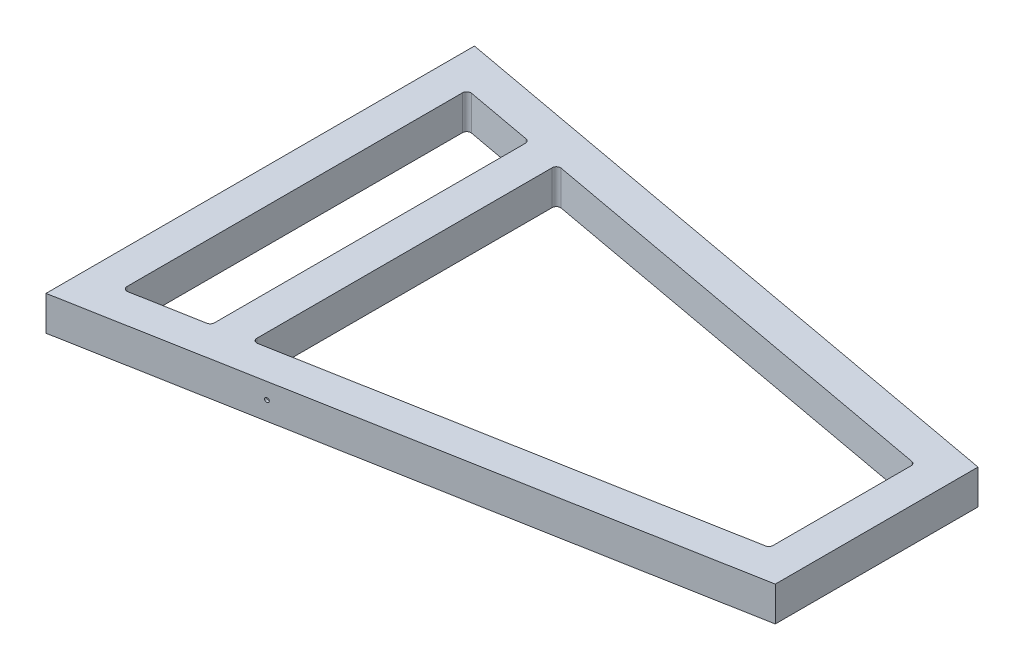
ISO-10303-21;
HEADER;
FILE_DESCRIPTION(('STEP AP214'),'2;1');
FILE_NAME('part.step','',(''),(''),'','','');
FILE_SCHEMA(('AUTOMOTIVE_DESIGN { 1 0 10303 214 1 1 1 1 }'));
ENDSEC;
DATA;
#1=APPLICATION_CONTEXT('core data for automotive mechanical design processes');
#2=APPLICATION_PROTOCOL_DEFINITION('international standard','automotive_design',2000,#1);
#3=PRODUCT_CONTEXT('',#1,'mechanical');
#4=PRODUCT('Part','Part','',(#3));
#5=PRODUCT_RELATED_PRODUCT_CATEGORY('part','',(#4));
#6=PRODUCT_DEFINITION_FORMATION('','',#4);
#7=PRODUCT_DEFINITION_CONTEXT('part definition',#1,'design');
#8=PRODUCT_DEFINITION('design','',#6,#7);
#9=PRODUCT_DEFINITION_SHAPE('','',#8);
#10=(LENGTH_UNIT() NAMED_UNIT(*) SI_UNIT(.MILLI.,.METRE.));
#11=(NAMED_UNIT(*) PLANE_ANGLE_UNIT() SI_UNIT($,.RADIAN.));
#12=(NAMED_UNIT(*) SI_UNIT($,.STERADIAN.) SOLID_ANGLE_UNIT());
#13=UNCERTAINTY_MEASURE_WITH_UNIT(LENGTH_MEASURE(1.E-05),#10,'distance_accuracy_value','');
#14=(GEOMETRIC_REPRESENTATION_CONTEXT(3) GLOBAL_UNCERTAINTY_ASSIGNED_CONTEXT((#13)) GLOBAL_UNIT_ASSIGNED_CONTEXT((#10,
#11,#12)) REPRESENTATION_CONTEXT('',''));
#15=CARTESIAN_POINT('',(0.,0.,0.));
#16=DIRECTION('',(0.,0.,1.));
#17=DIRECTION('',(1.,0.,0.));
#18=AXIS2_PLACEMENT_3D('',#15,#16,#17);
#19=CARTESIAN_POINT('',(117.12676056338,25.,-52.5));
#20=DIRECTION('',(-0.180087544253307,0.,0.9836505865422));
#21=DIRECTION('',(0.9836505865422,0.,0.180087544253307));
#22=AXIS2_PLACEMENT_3D('',#19,#20,#21);
#23=PLANE('',#22);
#24=DIRECTION('',(-0.9836505865422,0.,-0.180087544253307));
#25=VECTOR('',#24,1.);
#26=CARTESIAN_POINT('',(117.12676056338,0.,-52.5));
#27=LINE('',#26,#25);
#28=CARTESIAN_POINT('',(-226.93297680386,0.,-115.490734745265));
#29=VERTEX_POINT('',#28);
#30=CARTESIAN_POINT('',(-275.33297680386,0.,-124.351845856376));
#31=VERTEX_POINT('',#30);
#32=EDGE_CURVE('E370',#29,#31,#27,.T.);
#33=ORIENTED_EDGE('',*,*,#32,.F.);
#34=DIRECTION('',(0.,-1.,0.));
#35=VECTOR('',#34,1.);
#36=CARTESIAN_POINT('',(-226.93297680386,25.,-115.490734745265));
#37=LINE('',#36,#35);
#38=CARTESIAN_POINT('',(-226.93297680386,25.,-115.490734745265));
#39=VERTEX_POINT('',#38);
#40=EDGE_CURVE('E418',#29,#39,#37,.F.);
#41=ORIENTED_EDGE('',*,*,#40,.T.);
#42=DIRECTION('',(-0.9836505865422,0.,-0.180087544253307));
#43=VECTOR('',#42,1.);
#44=CARTESIAN_POINT('',(117.12676056338,25.,-52.5));
#45=LINE('',#44,#43);
#46=CARTESIAN_POINT('',(-275.33297680386,25.,-124.351845856376));
#47=VERTEX_POINT('',#46);
#48=EDGE_CURVE('E356',#39,#47,#45,.T.);
#49=ORIENTED_EDGE('',*,*,#48,.T.);
#50=DIRECTION('',(0.,-1.,0.));
#51=VECTOR('',#50,1.);
#52=CARTESIAN_POINT('',(-275.33297680386,0.,-124.351845856376));
#53=LINE('',#52,#51);
#54=EDGE_CURVE('E415',#47,#31,#53,.T.);
#55=ORIENTED_EDGE('',*,*,#54,.T.);
#56=EDGE_LOOP('',(#33,#41,#49,#55));
#57=FACE_BOUND('',#56,.T.);
#58=ADVANCED_FACE('F61',(#57),#23,.T.);
#59=CARTESIAN_POINT('',(117.12676056338,25.,52.5));
#60=DIRECTION('',(-0.180087544253307,0.,-0.9836505865422));
#61=DIRECTION('',(-0.9836505865422,0.,0.180087544253307));
#62=AXIS2_PLACEMENT_3D('',#59,#60,#61);
#63=PLANE('',#62);
#64=DIRECTION('',(0.9836505865422,0.,-0.180087544253307));
#65=VECTOR('',#64,1.);
#66=CARTESIAN_POINT('',(117.12676056338,0.,52.5));
#67=LINE('',#66,#65);
#68=CARTESIAN_POINT('',(-275.33297680386,0.,124.351845856376));
#69=VERTEX_POINT('',#68);
#70=CARTESIAN_POINT('',(-226.93297680386,0.,115.490734745265));
#71=VERTEX_POINT('',#70);
#72=EDGE_CURVE('E357',#69,#71,#67,.T.);
#73=ORIENTED_EDGE('',*,*,#72,.F.);
#74=DIRECTION('',(0.,-1.,0.));
#75=VECTOR('',#74,1.);
#76=CARTESIAN_POINT('',(-275.33297680386,25.,124.351845856376));
#77=LINE('',#76,#75);
#78=CARTESIAN_POINT('',(-275.33297680386,25.,124.351845856376));
#79=VERTEX_POINT('',#78);
#80=EDGE_CURVE('E437',#69,#79,#77,.F.);
#81=ORIENTED_EDGE('',*,*,#80,.T.);
#82=DIRECTION('',(0.9836505865422,0.,-0.180087544253307));
#83=VECTOR('',#82,1.);
#84=CARTESIAN_POINT('',(117.12676056338,25.,52.5));
#85=LINE('',#84,#83);
#86=CARTESIAN_POINT('',(-226.93297680386,25.,115.490734745265));
#87=VERTEX_POINT('',#86);
#88=EDGE_CURVE('E364',#79,#87,#85,.T.);
#89=ORIENTED_EDGE('',*,*,#88,.T.);
#90=DIRECTION('',(0.,1.,0.));
#91=VECTOR('',#90,1.);
#92=CARTESIAN_POINT('',(-226.93297680386,25.,115.490734745265));
#93=LINE('',#92,#91);
#94=EDGE_CURVE('E435',#87,#71,#93,.F.);
#95=ORIENTED_EDGE('',*,*,#94,.T.);
#96=EDGE_LOOP('',(#73,#81,#89,#95));
#97=FACE_BOUND('',#96,.T.);
#98=ADVANCED_FACE('F511',(#97),#63,.T.);
#99=CARTESIAN_POINT('',(0.,25.,0.));
#100=DIRECTION('',(0.,1.,0.));
#101=DIRECTION('',(0.,0.,1.));
#102=AXIS2_PLACEMENT_3D('',#99,#100,#101);
#103=PLANE('',#102);
#104=ORIENTED_EDGE('',*,*,#48,.F.);
#105=CARTESIAN_POINT('',(-227.47323943662,25.,-112.539782985638));
#106=DIRECTION('',(0.,1.,0.));
#107=DIRECTION('',(0.,0.,1.));
#108=AXIS2_PLACEMENT_3D('',#105,#106,#107);
#109=CIRCLE('',#108,3.);
#110=CARTESIAN_POINT('',(-224.47323943662,25.,-112.539782985638));
#111=VERTEX_POINT('',#110);
#112=EDGE_CURVE('E450',#39,#111,#109,.F.);
#113=ORIENTED_EDGE('',*,*,#112,.T.);
#114=DIRECTION('',(0.,0.,-1.));
#115=VECTOR('',#114,1.);
#116=CARTESIAN_POINT('',(-224.47323943662,25.,-110.463383838384));
#117=LINE('',#116,#115);
#118=CARTESIAN_POINT('',(-224.47323943662,25.,112.539782985638));
#119=VERTEX_POINT('',#118);
#120=EDGE_CURVE('E341',#111,#119,#117,.F.);
#121=ORIENTED_EDGE('',*,*,#120,.T.);
#122=CARTESIAN_POINT('',(-227.47323943662,25.,112.539782985638));
#123=DIRECTION('',(0.,1.,0.));
#124=DIRECTION('',(0.,0.,1.));
#125=AXIS2_PLACEMENT_3D('',#122,#123,#124);
#126=CIRCLE('',#125,3.);
#127=EDGE_CURVE('E460',#119,#87,#126,.F.);
#128=ORIENTED_EDGE('',*,*,#127,.T.);
#129=ORIENTED_EDGE('',*,*,#88,.F.);
#130=CARTESIAN_POINT('',(-275.87323943662,25.,121.400894096749));
#131=DIRECTION('',(0.,1.,0.));
#132=DIRECTION('',(0.,0.,1.));
#133=AXIS2_PLACEMENT_3D('',#130,#131,#132);
#134=CIRCLE('',#133,3.);
#135=CARTESIAN_POINT('',(-278.87323943662,25.,121.400894096749));
#136=VERTEX_POINT('',#135);
#137=EDGE_CURVE('E458',#79,#136,#134,.F.);
#138=ORIENTED_EDGE('',*,*,#137,.T.);
#139=DIRECTION('',(0.,0.,1.));
#140=VECTOR('',#139,1.);
#141=CARTESIAN_POINT('',(-278.87323943662,25.,-125.));
#142=LINE('',#141,#140);
#143=CARTESIAN_POINT('',(-278.87323943662,25.,-121.400894096749));
#144=VERTEX_POINT('',#143);
#145=EDGE_CURVE('E360',#144,#136,#142,.T.);
#146=ORIENTED_EDGE('',*,*,#145,.F.);
#147=CARTESIAN_POINT('',(-275.87323943662,25.,-121.400894096749));
#148=DIRECTION('',(0.,1.,0.));
#149=DIRECTION('',(0.,0.,1.));
#150=AXIS2_PLACEMENT_3D('',#147,#148,#149);
#151=CIRCLE('',#150,3.);
#152=EDGE_CURVE('E12',#144,#47,#151,.F.);
#153=ORIENTED_EDGE('',*,*,#152,.T.);
#154=EDGE_LOOP('',(#104,#113,#121,#128,#129,#138,#146,#153));
#155=FACE_BOUND('',#154,.T.);
#156=DIRECTION('',(0.,0.,-1.));
#157=VECTOR('',#156,1.);
#158=CARTESIAN_POINT('',(142.12676056338,25.,0.));
#159=LINE('',#158,#157);
#160=CARTESIAN_POINT('',(142.12676056338,25.,73.3385087897144));
#161=VERTEX_POINT('',#160);
#162=CARTESIAN_POINT('',(142.12676056338,25.,-73.3385087897144));
#163=VERTEX_POINT('',#162);
#164=EDGE_CURVE('E380',#161,#163,#159,.T.);
#165=ORIENTED_EDGE('',*,*,#164,.T.);
#166=DIRECTION('',(-0.9836505865422,0.,-0.180087544253307));
#167=VECTOR('',#166,1.);
#168=CARTESIAN_POINT('',(17.6008068781914,25.,-96.136821017432));
#169=LINE('',#168,#167);
#170=CARTESIAN_POINT('',(-303.87323943662,25.,-154.992549193755));
#171=VERTEX_POINT('',#170);
#172=EDGE_CURVE('E383',#163,#171,#169,.T.);
#173=ORIENTED_EDGE('',*,*,#172,.T.);
#174=DIRECTION('',(0.,0.,1.));
#175=VECTOR('',#174,1.);
#176=CARTESIAN_POINT('',(-303.87323943662,25.,0.));
#177=LINE('',#176,#175);
#178=CARTESIAN_POINT('',(-303.87323943662,25.,154.992549193755));
#179=VERTEX_POINT('',#178);
#180=EDGE_CURVE('E386',#171,#179,#177,.T.);
#181=ORIENTED_EDGE('',*,*,#180,.T.);
#182=DIRECTION('',(0.9836505865422,0.,-0.180087544253307));
#183=VECTOR('',#182,1.);
#184=CARTESIAN_POINT('',(17.6008068781915,25.,96.136821017432));
#185=LINE('',#184,#183);
#186=EDGE_CURVE('E388',#179,#161,#185,.T.);
#187=ORIENTED_EDGE('',*,*,#186,.T.);
#188=EDGE_LOOP('',(#165,#173,#181,#187));
#189=FACE_BOUND('',#188,.T.);
#190=CARTESIAN_POINT('',(114.66702319614,25.,-52.9503307048609));
#191=VERTEX_POINT('',#190);
#192=CARTESIAN_POINT('',(-195.93297680386,25.,-109.81522969476));
#193=VERTEX_POINT('',#192);
#194=EDGE_CURVE('E358',#191,#193,#45,.T.);
#195=ORIENTED_EDGE('',*,*,#194,.F.);
#196=CARTESIAN_POINT('',(114.12676056338,25.,-49.9993789452343));
#197=DIRECTION('',(0.,1.,0.));
#198=DIRECTION('',(0.,0.,1.));
#199=AXIS2_PLACEMENT_3D('',#196,#197,#198);
#200=CIRCLE('',#199,3.);
#201=CARTESIAN_POINT('',(117.12676056338,25.,-49.9993789452343));
#202=VERTEX_POINT('',#201);
#203=EDGE_CURVE('E470',#191,#202,#200,.F.);
#204=ORIENTED_EDGE('',*,*,#203,.T.);
#205=DIRECTION('',(0.,0.,-1.));
#206=VECTOR('',#205,1.);
#207=CARTESIAN_POINT('',(117.12676056338,25.,-52.5));
#208=LINE('',#207,#206);
#209=CARTESIAN_POINT('',(117.12676056338,25.,49.9993789452342));
#210=VERTEX_POINT('',#209);
#211=EDGE_CURVE('E353',#210,#202,#208,.T.);
#212=ORIENTED_EDGE('',*,*,#211,.F.);
#213=CARTESIAN_POINT('',(114.12676056338,25.,49.9993789452342));
#214=DIRECTION('',(0.,1.,0.));
#215=DIRECTION('',(0.,0.,1.));
#216=AXIS2_PLACEMENT_3D('',#213,#214,#215);
#217=CIRCLE('',#216,3.);
#218=CARTESIAN_POINT('',(114.66702319614,25.,52.9503307048608));
#219=VERTEX_POINT('',#218);
#220=EDGE_CURVE('E466',#210,#219,#217,.F.);
#221=ORIENTED_EDGE('',*,*,#220,.T.);
#222=CARTESIAN_POINT('',(-195.93297680386,25.,109.81522969476));
#223=VERTEX_POINT('',#222);
#224=EDGE_CURVE('E363',#223,#219,#85,.T.);
#225=ORIENTED_EDGE('',*,*,#224,.F.);
#226=CARTESIAN_POINT('',(-196.47323943662,25.,106.864277935133));
#227=DIRECTION('',(0.,1.,0.));
#228=DIRECTION('',(0.,0.,1.));
#229=AXIS2_PLACEMENT_3D('',#226,#227,#228);
#230=CIRCLE('',#229,3.);
#231=CARTESIAN_POINT('',(-199.47323943662,25.,106.864277935133));
#232=VERTEX_POINT('',#231);
#233=EDGE_CURVE('E454',#223,#232,#230,.F.);
#234=ORIENTED_EDGE('',*,*,#233,.T.);
#235=DIRECTION('',(0.,0.,1.));
#236=VECTOR('',#235,1.);
#237=CARTESIAN_POINT('',(-199.47323943662,25.,-110.463383838384));
#238=LINE('',#237,#236);
#239=CARTESIAN_POINT('',(-199.47323943662,25.,-106.864277935133));
#240=VERTEX_POINT('',#239);
#241=EDGE_CURVE('E344',#240,#232,#238,.T.);
#242=ORIENTED_EDGE('',*,*,#241,.F.);
#243=CARTESIAN_POINT('',(-196.47323943662,25.,-106.864277935133));
#244=DIRECTION('',(0.,1.,0.));
#245=DIRECTION('',(0.,0.,1.));
#246=AXIS2_PLACEMENT_3D('',#243,#244,#245);
#247=CIRCLE('',#246,3.);
#248=EDGE_CURVE('E76',#240,#193,#247,.F.);
#249=ORIENTED_EDGE('',*,*,#248,.T.);
#250=EDGE_LOOP('',(#195,#204,#212,#221,#225,#234,#242,#249));
#251=FACE_BOUND('',#250,.T.);
#252=ADVANCED_FACE('F491',(#155,#189,#251),#103,.T.);
#253=CARTESIAN_POINT('',(0.,0.,0.));
#254=DIRECTION('',(0.,1.,0.));
#255=DIRECTION('',(0.,0.,1.));
#256=AXIS2_PLACEMENT_3D('',#253,#254,#255);
#257=PLANE('',#256);
#258=DIRECTION('',(0.,0.,-1.));
#259=VECTOR('',#258,1.);
#260=CARTESIAN_POINT('',(117.12676056338,0.,-52.5));
#261=LINE('',#260,#259);
#262=CARTESIAN_POINT('',(117.12676056338,0.,49.9993789452342));
#263=VERTEX_POINT('',#262);
#264=CARTESIAN_POINT('',(117.12676056338,0.,-49.9993789452343));
#265=VERTEX_POINT('',#264);
#266=EDGE_CURVE('E348',#263,#265,#261,.T.);
#267=ORIENTED_EDGE('',*,*,#266,.T.);
#268=CARTESIAN_POINT('',(114.12676056338,0.,-49.9993789452343));
#269=DIRECTION('',(0.,1.,0.));
#270=DIRECTION('',(0.,0.,1.));
#271=AXIS2_PLACEMENT_3D('',#268,#269,#270);
#272=CIRCLE('',#271,3.);
#273=CARTESIAN_POINT('',(114.66702319614,0.,-52.9503307048609));
#274=VERTEX_POINT('',#273);
#275=EDGE_CURVE('E468',#265,#274,#272,.T.);
#276=ORIENTED_EDGE('',*,*,#275,.T.);
#277=CARTESIAN_POINT('',(-195.93297680386,0.,-109.81522969476));
#278=VERTEX_POINT('',#277);
#279=EDGE_CURVE('E371',#274,#278,#27,.T.);
#280=ORIENTED_EDGE('',*,*,#279,.T.);
#281=CARTESIAN_POINT('',(-196.47323943662,0.,-106.864277935133));
#282=DIRECTION('',(0.,1.,0.));
#283=DIRECTION('',(0.,0.,1.));
#284=AXIS2_PLACEMENT_3D('',#281,#282,#283);
#285=CIRCLE('',#284,3.);
#286=CARTESIAN_POINT('',(-199.47323943662,0.,-106.864277935133));
#287=VERTEX_POINT('',#286);
#288=EDGE_CURVE('E472',#278,#287,#285,.T.);
#289=ORIENTED_EDGE('',*,*,#288,.T.);
#290=DIRECTION('',(0.,0.,1.));
#291=VECTOR('',#290,1.);
#292=CARTESIAN_POINT('',(-199.47323943662,0.,-110.463383838384));
#293=LINE('',#292,#291);
#294=CARTESIAN_POINT('',(-199.47323943662,0.,106.864277935133));
#295=VERTEX_POINT('',#294);
#296=EDGE_CURVE('E345',#287,#295,#293,.T.);
#297=ORIENTED_EDGE('',*,*,#296,.T.);
#298=CARTESIAN_POINT('',(-196.47323943662,0.,106.864277935133));
#299=DIRECTION('',(0.,1.,0.));
#300=DIRECTION('',(0.,0.,1.));
#301=AXIS2_PLACEMENT_3D('',#298,#299,#300);
#302=CIRCLE('',#301,3.);
#303=CARTESIAN_POINT('',(-195.93297680386,0.,109.81522969476));
#304=VERTEX_POINT('',#303);
#305=EDGE_CURVE('E452',#295,#304,#302,.T.);
#306=ORIENTED_EDGE('',*,*,#305,.T.);
#307=CARTESIAN_POINT('',(114.66702319614,0.,52.9503307048608));
#308=VERTEX_POINT('',#307);
#309=EDGE_CURVE('E377',#304,#308,#67,.T.);
#310=ORIENTED_EDGE('',*,*,#309,.T.);
#311=CARTESIAN_POINT('',(114.12676056338,0.,49.9993789452342));
#312=DIRECTION('',(0.,1.,0.));
#313=DIRECTION('',(0.,0.,1.));
#314=AXIS2_PLACEMENT_3D('',#311,#312,#313);
#315=CIRCLE('',#314,3.);
#316=EDGE_CURVE('E464',#308,#263,#315,.T.);
#317=ORIENTED_EDGE('',*,*,#316,.T.);
#318=EDGE_LOOP('',(#267,#276,#280,#289,#297,#306,#310,#317));
#319=FACE_BOUND('',#318,.T.);
#320=DIRECTION('',(0.,0.,-1.));
#321=VECTOR('',#320,1.);
#322=CARTESIAN_POINT('',(142.12676056338,0.,0.));
#323=LINE('',#322,#321);
#324=CARTESIAN_POINT('',(142.12676056338,0.,73.3385087897144));
#325=VERTEX_POINT('',#324);
#326=CARTESIAN_POINT('',(142.12676056338,0.,-73.3385087897144));
#327=VERTEX_POINT('',#326);
#328=EDGE_CURVE('E367',#325,#327,#323,.T.);
#329=ORIENTED_EDGE('',*,*,#328,.F.);
#330=DIRECTION('',(0.9836505865422,0.,-0.180087544253307));
#331=VECTOR('',#330,1.);
#332=CARTESIAN_POINT('',(17.6008068781915,0.,96.136821017432));
#333=LINE('',#332,#331);
#334=CARTESIAN_POINT('',(-303.87323943662,0.,154.992549193755));
#335=VERTEX_POINT('',#334);
#336=EDGE_CURVE('E384',#335,#325,#333,.T.);
#337=ORIENTED_EDGE('',*,*,#336,.F.);
#338=DIRECTION('',(0.,0.,1.));
#339=VECTOR('',#338,1.);
#340=CARTESIAN_POINT('',(-303.87323943662,0.,0.));
#341=LINE('',#340,#339);
#342=CARTESIAN_POINT('',(-303.87323943662,0.,-154.992549193755));
#343=VERTEX_POINT('',#342);
#344=EDGE_CURVE('E395',#343,#335,#341,.T.);
#345=ORIENTED_EDGE('',*,*,#344,.F.);
#346=DIRECTION('',(-0.9836505865422,0.,-0.180087544253307));
#347=VECTOR('',#346,1.);
#348=CARTESIAN_POINT('',(17.6008068781914,0.,-96.136821017432));
#349=LINE('',#348,#347);
#350=EDGE_CURVE('E393',#327,#343,#349,.T.);
#351=ORIENTED_EDGE('',*,*,#350,.F.);
#352=EDGE_LOOP('',(#329,#337,#345,#351));
#353=FACE_BOUND('',#352,.T.);
#354=DIRECTION('',(0.,0.,-1.));
#355=VECTOR('',#354,1.);
#356=CARTESIAN_POINT('',(-224.47323943662,0.,-110.463383838384));
#357=LINE('',#356,#355);
#358=CARTESIAN_POINT('',(-224.47323943662,0.,-112.539782985638));
#359=VERTEX_POINT('',#358);
#360=CARTESIAN_POINT('',(-224.47323943662,0.,112.539782985638));
#361=VERTEX_POINT('',#360);
#362=EDGE_CURVE('E340',#359,#361,#357,.F.);
#363=ORIENTED_EDGE('',*,*,#362,.F.);
#364=CARTESIAN_POINT('',(-227.47323943662,0.,-112.539782985638));
#365=DIRECTION('',(0.,1.,0.));
#366=DIRECTION('',(0.,0.,1.));
#367=AXIS2_PLACEMENT_3D('',#364,#365,#366);
#368=CIRCLE('',#367,3.);
#369=EDGE_CURVE('E448',#359,#29,#368,.T.);
#370=ORIENTED_EDGE('',*,*,#369,.T.);
#371=ORIENTED_EDGE('',*,*,#32,.T.);
#372=CARTESIAN_POINT('',(-275.87323943662,0.,-121.400894096749));
#373=DIRECTION('',(0.,1.,0.));
#374=DIRECTION('',(0.,0.,1.));
#375=AXIS2_PLACEMENT_3D('',#372,#373,#374);
#376=CIRCLE('',#375,3.);
#377=CARTESIAN_POINT('',(-278.87323943662,0.,-121.400894096749));
#378=VERTEX_POINT('',#377);
#379=EDGE_CURVE('E69',#31,#378,#376,.T.);
#380=ORIENTED_EDGE('',*,*,#379,.T.);
#381=DIRECTION('',(0.,0.,1.));
#382=VECTOR('',#381,1.);
#383=CARTESIAN_POINT('',(-278.87323943662,0.,-125.));
#384=LINE('',#383,#382);
#385=CARTESIAN_POINT('',(-278.87323943662,0.,121.400894096749));
#386=VERTEX_POINT('',#385);
#387=EDGE_CURVE('E374',#378,#386,#384,.T.);
#388=ORIENTED_EDGE('',*,*,#387,.T.);
#389=CARTESIAN_POINT('',(-275.87323943662,0.,121.400894096749));
#390=DIRECTION('',(0.,1.,0.));
#391=DIRECTION('',(0.,0.,1.));
#392=AXIS2_PLACEMENT_3D('',#389,#390,#391);
#393=CIRCLE('',#392,3.);
#394=EDGE_CURVE('E456',#386,#69,#393,.T.);
#395=ORIENTED_EDGE('',*,*,#394,.T.);
#396=ORIENTED_EDGE('',*,*,#72,.T.);
#397=CARTESIAN_POINT('',(-227.47323943662,0.,112.539782985638));
#398=DIRECTION('',(0.,1.,0.));
#399=DIRECTION('',(0.,0.,1.));
#400=AXIS2_PLACEMENT_3D('',#397,#398,#399);
#401=CIRCLE('',#400,3.);
#402=EDGE_CURVE('E462',#71,#361,#401,.T.);
#403=ORIENTED_EDGE('',*,*,#402,.T.);
#404=EDGE_LOOP('',(#363,#370,#371,#380,#388,#395,#396,#403));
#405=FACE_BOUND('',#404,.T.);
#406=ADVANCED_FACE('F478',(#319,#353,#405),#257,.F.);
#407=CARTESIAN_POINT('',(142.12676056338,25.,0.));
#408=DIRECTION('',(-1.,0.,0.));
#409=DIRECTION('',(0.,0.,1.));
#410=AXIS2_PLACEMENT_3D('',#407,#408,#409);
#411=PLANE('',#410);
#412=ORIENTED_EDGE('',*,*,#328,.T.);
#413=DIRECTION('',(0.,-1.,0.));
#414=VECTOR('',#413,1.);
#415=CARTESIAN_POINT('',(142.12676056338,25.,-73.3385087897144));
#416=LINE('',#415,#414);
#417=EDGE_CURVE('E406',#163,#327,#416,.T.);
#418=ORIENTED_EDGE('',*,*,#417,.F.);
#419=ORIENTED_EDGE('',*,*,#164,.F.);
#420=DIRECTION('',(0.,-1.,0.));
#421=VECTOR('',#420,1.);
#422=CARTESIAN_POINT('',(142.12676056338,25.,73.3385087897144));
#423=LINE('',#422,#421);
#424=EDGE_CURVE('E390',#161,#325,#423,.T.);
#425=ORIENTED_EDGE('',*,*,#424,.T.);
#426=EDGE_LOOP('',(#412,#418,#419,#425));
#427=FACE_BOUND('',#426,.T.);
#428=ADVANCED_FACE('F572',(#427),#411,.F.);
#429=CARTESIAN_POINT('',(17.6008068781914,25.,-96.136821017432));
#430=DIRECTION('',(-0.180087544253307,0.,0.9836505865422));
#431=DIRECTION('',(0.9836505865422,0.,0.180087544253307));
#432=AXIS2_PLACEMENT_3D('',#429,#430,#431);
#433=PLANE('',#432);
#434=ORIENTED_EDGE('',*,*,#350,.T.);
#435=DIRECTION('',(0.,-1.,0.));
#436=VECTOR('',#435,1.);
#437=CARTESIAN_POINT('',(-303.87323943662,25.,-154.992549193755));
#438=LINE('',#437,#436);
#439=EDGE_CURVE('E403',#171,#343,#438,.T.);
#440=ORIENTED_EDGE('',*,*,#439,.F.);
#441=ORIENTED_EDGE('',*,*,#172,.F.);
#442=ORIENTED_EDGE('',*,*,#417,.T.);
#443=EDGE_LOOP('',(#434,#440,#441,#442));
#444=FACE_BOUND('',#443,.T.);
#445=ADVANCED_FACE('F589',(#444),#433,.F.);
#446=CARTESIAN_POINT('',(-303.87323943662,25.,0.));
#447=DIRECTION('',(1.,0.,0.));
#448=DIRECTION('',(0.,0.,-1.));
#449=AXIS2_PLACEMENT_3D('',#446,#447,#448);
#450=PLANE('',#449);
#451=ORIENTED_EDGE('',*,*,#344,.T.);
#452=DIRECTION('',(0.,-1.,0.));
#453=VECTOR('',#452,1.);
#454=CARTESIAN_POINT('',(-303.87323943662,25.,154.992549193755));
#455=LINE('',#454,#453);
#456=EDGE_CURVE('E400',#179,#335,#455,.T.);
#457=ORIENTED_EDGE('',*,*,#456,.F.);
#458=ORIENTED_EDGE('',*,*,#180,.F.);
#459=ORIENTED_EDGE('',*,*,#439,.T.);
#460=EDGE_LOOP('',(#451,#457,#458,#459));
#461=FACE_BOUND('',#460,.T.);
#462=ADVANCED_FACE('F586',(#461),#450,.F.);
#463=CARTESIAN_POINT('',(17.6008068781915,25.,96.136821017432));
#464=DIRECTION('',(-0.180087544253307,0.,-0.9836505865422));
#465=DIRECTION('',(-0.9836505865422,0.,0.180087544253307));
#466=AXIS2_PLACEMENT_3D('',#463,#464,#465);
#467=PLANE('',#466);
#468=CARTESIAN_POINT('',(-168.76616417077,13.3263532192132,130.257036676649));
#469=DIRECTION('',(0.180087544253307,0.,0.9836505865422));
#470=DIRECTION('',(0.9836505865422,0.,-0.180087544253307));
#471=AXIS2_PLACEMENT_3D('',#468,#469,#470);
#472=CIRCLE('',#471,1.49999999999998);
#473=CARTESIAN_POINT('',(-167.290688290957,13.3263532192132,129.986905360269));
#474=VERTEX_POINT('',#473);
#475=EDGE_CURVE('E337',#474,#474,#472,.T.);
#476=ORIENTED_EDGE('',*,*,#475,.F.);
#477=EDGE_LOOP('',(#476));
#478=FACE_BOUND('',#477,.T.);
#479=ORIENTED_EDGE('',*,*,#336,.T.);
#480=ORIENTED_EDGE('',*,*,#424,.F.);
#481=ORIENTED_EDGE('',*,*,#186,.F.);
#482=ORIENTED_EDGE('',*,*,#456,.T.);
#483=EDGE_LOOP('',(#479,#480,#481,#482));
#484=FACE_BOUND('',#483,.T.);
#485=ADVANCED_FACE('F542',(#478,#484),#467,.F.);
#486=CARTESIAN_POINT('',(117.12676056338,25.,-52.5));
#487=DIRECTION('',(-1.,0.,0.));
#488=DIRECTION('',(0.,0.,1.));
#489=AXIS2_PLACEMENT_3D('',#486,#487,#488);
#490=PLANE('',#489);
#491=ORIENTED_EDGE('',*,*,#266,.F.);
#492=DIRECTION('',(0.,-1.,0.));
#493=VECTOR('',#492,1.);
#494=CARTESIAN_POINT('',(117.12676056338,25.,49.9993789452342));
#495=LINE('',#494,#493);
#496=EDGE_CURVE('E442',#263,#210,#495,.F.);
#497=ORIENTED_EDGE('',*,*,#496,.T.);
#498=ORIENTED_EDGE('',*,*,#211,.T.);
#499=DIRECTION('',(0.,-1.,0.));
#500=VECTOR('',#499,1.);
#501=CARTESIAN_POINT('',(117.12676056338,0.,-49.9993789452343));
#502=LINE('',#501,#500);
#503=EDGE_CURVE('E439',#202,#265,#502,.T.);
#504=ORIENTED_EDGE('',*,*,#503,.T.);
#505=EDGE_LOOP('',(#491,#497,#498,#504));
#506=FACE_BOUND('',#505,.T.);
#507=ADVANCED_FACE('F537',(#506),#490,.T.);
#508=ORIENTED_EDGE('',*,*,#279,.F.);
#509=DIRECTION('',(0.,-1.,0.));
#510=VECTOR('',#509,1.);
#511=CARTESIAN_POINT('',(114.66702319614,25.,-52.9503307048609));
#512=LINE('',#511,#510);
#513=EDGE_CURVE('E83',#274,#191,#512,.F.);
#514=ORIENTED_EDGE('',*,*,#513,.T.);
#515=ORIENTED_EDGE('',*,*,#194,.T.);
#516=DIRECTION('',(0.,-1.,0.));
#517=VECTOR('',#516,1.);
#518=CARTESIAN_POINT('',(-195.93297680386,0.,-109.81522969476));
#519=LINE('',#518,#517);
#520=EDGE_CURVE('E444',#193,#278,#519,.T.);
#521=ORIENTED_EDGE('',*,*,#520,.T.);
#522=EDGE_LOOP('',(#508,#514,#515,#521));
#523=FACE_BOUND('',#522,.T.);
#524=ADVANCED_FACE('F528',(#523),#23,.T.);
#525=CARTESIAN_POINT('',(-278.87323943662,25.,-125.));
#526=DIRECTION('',(1.,0.,0.));
#527=DIRECTION('',(0.,0.,-1.));
#528=AXIS2_PLACEMENT_3D('',#525,#526,#527);
#529=PLANE('',#528);
#530=ORIENTED_EDGE('',*,*,#145,.T.);
#531=DIRECTION('',(0.,-1.,0.));
#532=VECTOR('',#531,1.);
#533=CARTESIAN_POINT('',(-278.87323943662,0.,121.400894096749));
#534=LINE('',#533,#532);
#535=EDGE_CURVE('E432',#136,#386,#534,.T.);
#536=ORIENTED_EDGE('',*,*,#535,.T.);
#537=ORIENTED_EDGE('',*,*,#387,.F.);
#538=DIRECTION('',(0.,-1.,0.));
#539=VECTOR('',#538,1.);
#540=CARTESIAN_POINT('',(-278.87323943662,25.,-121.400894096749));
#541=LINE('',#540,#539);
#542=EDGE_CURVE('E430',#378,#144,#541,.F.);
#543=ORIENTED_EDGE('',*,*,#542,.T.);
#544=EDGE_LOOP('',(#530,#536,#537,#543));
#545=FACE_BOUND('',#544,.T.);
#546=ADVANCED_FACE('F484',(#545),#529,.T.);
#547=ORIENTED_EDGE('',*,*,#309,.F.);
#548=DIRECTION('',(0.,-1.,0.));
#549=VECTOR('',#548,1.);
#550=CARTESIAN_POINT('',(-195.93297680386,25.,109.81522969476));
#551=LINE('',#550,#549);
#552=EDGE_CURVE('E428',#304,#223,#551,.F.);
#553=ORIENTED_EDGE('',*,*,#552,.T.);
#554=ORIENTED_EDGE('',*,*,#224,.T.);
#555=DIRECTION('',(0.,-1.,0.));
#556=VECTOR('',#555,1.);
#557=CARTESIAN_POINT('',(114.66702319614,0.,52.9503307048608));
#558=LINE('',#557,#556);
#559=EDGE_CURVE('E425',#219,#308,#558,.T.);
#560=ORIENTED_EDGE('',*,*,#559,.T.);
#561=EDGE_LOOP('',(#547,#553,#554,#560));
#562=FACE_BOUND('',#561,.T.);
#563=ADVANCED_FACE('F533',(#562),#63,.T.);
#564=CARTESIAN_POINT('',(-224.47323943662,25.,-110.463383838384));
#565=DIRECTION('',(1.,0.,0.));
#566=DIRECTION('',(0.,0.,-1.));
#567=AXIS2_PLACEMENT_3D('',#564,#565,#566);
#568=PLANE('',#567);
#569=ORIENTED_EDGE('',*,*,#120,.F.);
#570=DIRECTION('',(0.,-1.,0.));
#571=VECTOR('',#570,1.);
#572=CARTESIAN_POINT('',(-224.47323943662,25.,-112.539782985638));
#573=LINE('',#572,#571);
#574=EDGE_CURVE('E412',#111,#359,#573,.T.);
#575=ORIENTED_EDGE('',*,*,#574,.T.);
#576=ORIENTED_EDGE('',*,*,#362,.T.);
#577=DIRECTION('',(0.,1.,0.));
#578=VECTOR('',#577,1.);
#579=CARTESIAN_POINT('',(-224.47323943662,25.,112.539782985638));
#580=LINE('',#579,#578);
#581=EDGE_CURVE('E409',#361,#119,#580,.T.);
#582=ORIENTED_EDGE('',*,*,#581,.T.);
#583=EDGE_LOOP('',(#569,#575,#576,#582));
#584=FACE_BOUND('',#583,.T.);
#585=ADVANCED_FACE('F501',(#584),#568,.F.);
#586=CARTESIAN_POINT('',(-199.47323943662,25.,-110.463383838384));
#587=DIRECTION('',(1.,0.,0.));
#588=DIRECTION('',(0.,0.,-1.));
#589=AXIS2_PLACEMENT_3D('',#586,#587,#588);
#590=PLANE('',#589);
#591=ORIENTED_EDGE('',*,*,#241,.T.);
#592=DIRECTION('',(0.,-1.,0.));
#593=VECTOR('',#592,1.);
#594=CARTESIAN_POINT('',(-199.47323943662,0.,106.864277935133));
#595=LINE('',#594,#593);
#596=EDGE_CURVE('E422',#232,#295,#595,.T.);
#597=ORIENTED_EDGE('',*,*,#596,.T.);
#598=ORIENTED_EDGE('',*,*,#296,.F.);
#599=DIRECTION('',(0.,-1.,0.));
#600=VECTOR('',#599,1.);
#601=CARTESIAN_POINT('',(-199.47323943662,25.,-106.864277935133));
#602=LINE('',#601,#600);
#603=EDGE_CURVE('E420',#287,#240,#602,.F.);
#604=ORIENTED_EDGE('',*,*,#603,.T.);
#605=EDGE_LOOP('',(#591,#597,#598,#604));
#606=FACE_BOUND('',#605,.T.);
#607=ADVANCED_FACE('F565',(#606),#590,.T.);
#608=CARTESIAN_POINT('',(-169.126339259277,13.3263532192132,128.289735503564));
#609=DIRECTION('',(0.180087544253307,0.,0.9836505865422));
#610=DIRECTION('',(0.9836505865422,0.,-0.180087544253307));
#611=AXIS2_PLACEMENT_3D('',#608,#609,#610);
#612=CYLINDRICAL_SURFACE('',#611,1.49999999999998);
#613=CARTESIAN_POINT('',(-169.126339259277,13.3263532192132,128.289735503564));
#614=DIRECTION('',(0.180087544253307,0.,0.9836505865422));
#615=DIRECTION('',(0.9836505865422,0.,-0.180087544253307));
#616=AXIS2_PLACEMENT_3D('',#613,#614,#615);
#617=CIRCLE('',#616,1.49999999999998);
#618=CARTESIAN_POINT('',(-167.650863379463,13.3263532192132,128.019604187184));
#619=VERTEX_POINT('',#618);
#620=EDGE_CURVE('E310',#619,#619,#617,.T.);
#621=ORIENTED_EDGE('',*,*,#620,.F.);
#622=EDGE_LOOP('',(#621));
#623=FACE_BOUND('',#622,.T.);
#624=ORIENTED_EDGE('',*,*,#475,.T.);
#625=EDGE_LOOP('',(#624));
#626=FACE_BOUND('',#625,.T.);
#627=ADVANCED_FACE('F620',(#623,#626),#612,.F.);
#628=CARTESIAN_POINT('',(17.2406317896849,25.,94.1695198443476));
#629=DIRECTION('',(-0.180087544253307,0.,-0.9836505865422));
#630=DIRECTION('',(-0.9836505865422,0.,0.180087544253307));
#631=AXIS2_PLACEMENT_3D('',#628,#629,#630);
#632=PLANE('',#631);
#633=DIRECTION('',(0.9836505865422,0.,-0.180087544253307));
#634=VECTOR('',#633,1.);
#635=CARTESIAN_POINT('',(17.2406317896849,2.,94.1695198443476));
#636=LINE('',#635,#634);
#637=CARTESIAN_POINT('',(-301.87323943662,2.,152.593145258254));
#638=VERTEX_POINT('',#637);
#639=CARTESIAN_POINT('',(140.12676056338,2.,71.6714280865372));
#640=VERTEX_POINT('',#639);
#641=EDGE_CURVE('E986',#638,#640,#636,.T.);
#642=ORIENTED_EDGE('',*,*,#641,.F.);
#643=DIRECTION('',(0.,-1.,0.));
#644=VECTOR('',#643,1.);
#645=CARTESIAN_POINT('',(-301.87323943662,25.,152.593145258254));
#646=LINE('',#645,#644);
#647=CARTESIAN_POINT('',(-301.87323943662,23.,152.593145258254));
#648=VERTEX_POINT('',#647);
#649=EDGE_CURVE('E315',#648,#638,#646,.T.);
#650=ORIENTED_EDGE('',*,*,#649,.F.);
#651=DIRECTION('',(0.9836505865422,0.,-0.180087544253307));
#652=VECTOR('',#651,1.);
#653=CARTESIAN_POINT('',(17.2406317896849,23.,94.1695198443476));
#654=LINE('',#653,#652);
#655=CARTESIAN_POINT('',(140.12676056338,23.,71.6714280865372));
#656=VERTEX_POINT('',#655);
#657=EDGE_CURVE('E316',#648,#656,#654,.T.);
#658=ORIENTED_EDGE('',*,*,#657,.T.);
#659=DIRECTION('',(0.,-1.,0.));
#660=VECTOR('',#659,1.);
#661=CARTESIAN_POINT('',(140.12676056338,25.,71.6714280865372));
#662=LINE('',#661,#660);
#663=EDGE_CURVE('E312',#656,#640,#662,.T.);
#664=ORIENTED_EDGE('',*,*,#663,.T.);
#665=EDGE_LOOP('',(#642,#650,#658,#664));
#666=FACE_BOUND('',#665,.T.);
#667=ORIENTED_EDGE('',*,*,#620,.T.);
#668=EDGE_LOOP('',(#667));
#669=FACE_BOUND('',#668,.T.);
#670=ADVANCED_FACE('F623',(#666,#669),#632,.T.);
#671=CARTESIAN_POINT('',(117.486935651887,25.,-54.4673011730844));
#672=DIRECTION('',(-0.180087544253307,0.,0.9836505865422));
#673=DIRECTION('',(0.9836505865422,0.,0.180087544253307));
#674=AXIS2_PLACEMENT_3D('',#671,#672,#673);
#675=PLANE('',#674);
#676=DIRECTION('',(-0.9836505865422,0.,-0.180087544253307));
#677=VECTOR('',#676,1.);
#678=CARTESIAN_POINT('',(117.486935651887,2.,-54.4673011730844));
#679=LINE('',#678,#677);
#680=CARTESIAN_POINT('',(-222.47323943662,2.,-116.707484743581));
#681=VERTEX_POINT('',#680);
#682=CARTESIAN_POINT('',(-280.87323943662,2.,-127.3994039355));
#683=VERTEX_POINT('',#682);
#684=EDGE_CURVE('E271',#681,#683,#679,.T.);
#685=ORIENTED_EDGE('',*,*,#684,.T.);
#686=DIRECTION('',(0.,-1.,0.));
#687=VECTOR('',#686,1.);
#688=CARTESIAN_POINT('',(-280.87323943662,25.,-127.3994039355));
#689=LINE('',#688,#687);
#690=CARTESIAN_POINT('',(-280.87323943662,23.,-127.3994039355));
#691=VERTEX_POINT('',#690);
#692=EDGE_CURVE('E275',#691,#683,#689,.T.);
#693=ORIENTED_EDGE('',*,*,#692,.F.);
#694=DIRECTION('',(-0.9836505865422,0.,-0.180087544253307));
#695=VECTOR('',#694,1.);
#696=CARTESIAN_POINT('',(117.486935651887,23.,-54.4673011730844));
#697=LINE('',#696,#695);
#698=CARTESIAN_POINT('',(-222.47323943662,23.,-116.707484743581));
#699=VERTEX_POINT('',#698);
#700=EDGE_CURVE('E967',#699,#691,#697,.T.);
#701=ORIENTED_EDGE('',*,*,#700,.F.);
#702=DIRECTION('',(0.,-1.,0.));
#703=VECTOR('',#702,1.);
#704=CARTESIAN_POINT('',(-222.47323943662,25.,-116.707484743581));
#705=LINE('',#704,#703);
#706=EDGE_CURVE('E278',#699,#681,#705,.T.);
#707=ORIENTED_EDGE('',*,*,#706,.T.);
#708=EDGE_LOOP('',(#685,#693,#701,#707));
#709=FACE_BOUND('',#708,.T.);
#710=ADVANCED_FACE('F273',(#709),#675,.F.);
#711=CARTESIAN_POINT('',(117.486935651887,25.,54.4673011730844));
#712=DIRECTION('',(-0.180087544253307,0.,-0.9836505865422));
#713=DIRECTION('',(-0.9836505865422,0.,0.180087544253307));
#714=AXIS2_PLACEMENT_3D('',#711,#712,#713);
#715=PLANE('',#714);
#716=DIRECTION('',(0.9836505865422,0.,-0.180087544253307));
#717=VECTOR('',#716,1.);
#718=CARTESIAN_POINT('',(117.486935651887,23.,54.4673011730844));
#719=LINE('',#718,#717);
#720=CARTESIAN_POINT('',(-280.87323943662,23.,127.3994039355));
#721=VERTEX_POINT('',#720);
#722=CARTESIAN_POINT('',(-222.47323943662,23.,116.707484743581));
#723=VERTEX_POINT('',#722);
#724=EDGE_CURVE('E324',#721,#723,#719,.T.);
#725=ORIENTED_EDGE('',*,*,#724,.F.);
#726=DIRECTION('',(0.,-1.,0.));
#727=VECTOR('',#726,1.);
#728=CARTESIAN_POINT('',(-280.87323943662,25.,127.3994039355));
#729=LINE('',#728,#727);
#730=CARTESIAN_POINT('',(-280.87323943662,2.,127.3994039355));
#731=VERTEX_POINT('',#730);
#732=EDGE_CURVE('E292',#721,#731,#729,.T.);
#733=ORIENTED_EDGE('',*,*,#732,.T.);
#734=DIRECTION('',(0.9836505865422,0.,-0.180087544253307));
#735=VECTOR('',#734,1.);
#736=CARTESIAN_POINT('',(117.486935651887,2.,54.4673011730844));
#737=LINE('',#736,#735);
#738=CARTESIAN_POINT('',(-222.47323943662,2.,116.707484743581));
#739=VERTEX_POINT('',#738);
#740=EDGE_CURVE('E297',#731,#739,#737,.T.);
#741=ORIENTED_EDGE('',*,*,#740,.T.);
#742=DIRECTION('',(0.,1.,0.));
#743=VECTOR('',#742,1.);
#744=CARTESIAN_POINT('',(-222.47323943662,25.,116.707484743581));
#745=LINE('',#744,#743);
#746=EDGE_CURVE('E978',#739,#723,#745,.T.);
#747=ORIENTED_EDGE('',*,*,#746,.T.);
#748=EDGE_LOOP('',(#725,#733,#741,#747));
#749=FACE_BOUND('',#748,.T.);
#750=ADVANCED_FACE('F659',(#749),#715,.F.);
#751=CARTESIAN_POINT('',(0.,23.,0.));
#752=DIRECTION('',(0.,1.,0.));
#753=DIRECTION('',(0.,0.,1.));
#754=AXIS2_PLACEMENT_3D('',#751,#752,#753);
#755=PLANE('',#754);
#756=ORIENTED_EDGE('',*,*,#700,.T.);
#757=DIRECTION('',(0.,0.,1.));
#758=VECTOR('',#757,1.);
#759=CARTESIAN_POINT('',(-280.87323943662,23.,-125.));
#760=LINE('',#759,#758);
#761=EDGE_CURVE('E290',#691,#721,#760,.T.);
#762=ORIENTED_EDGE('',*,*,#761,.T.);
#763=ORIENTED_EDGE('',*,*,#724,.T.);
#764=DIRECTION('',(0.,0.,1.));
#765=VECTOR('',#764,1.);
#766=CARTESIAN_POINT('',(-222.47323943662,23.,-110.463383838384));
#767=LINE('',#766,#765);
#768=EDGE_CURVE('E977',#699,#723,#767,.T.);
#769=ORIENTED_EDGE('',*,*,#768,.F.);
#770=EDGE_LOOP('',(#756,#762,#763,#769));
#771=FACE_BOUND('',#770,.T.);
#772=DIRECTION('',(0.,0.,-1.));
#773=VECTOR('',#772,1.);
#774=CARTESIAN_POINT('',(140.12676056338,23.,0.));
#775=LINE('',#774,#773);
#776=CARTESIAN_POINT('',(140.12676056338,23.,-71.6714280865373));
#777=VERTEX_POINT('',#776);
#778=EDGE_CURVE('E988',#656,#777,#775,.T.);
#779=ORIENTED_EDGE('',*,*,#778,.F.);
#780=ORIENTED_EDGE('',*,*,#657,.F.);
#781=DIRECTION('',(0.,0.,1.));
#782=VECTOR('',#781,1.);
#783=CARTESIAN_POINT('',(-301.87323943662,23.,0.));
#784=LINE('',#783,#782);
#785=CARTESIAN_POINT('',(-301.87323943662,23.,-152.593145258254));
#786=VERTEX_POINT('',#785);
#787=EDGE_CURVE('E998',#786,#648,#784,.T.);
#788=ORIENTED_EDGE('',*,*,#787,.F.);
#789=DIRECTION('',(-0.9836505865422,0.,-0.180087544253307));
#790=VECTOR('',#789,1.);
#791=CARTESIAN_POINT('',(17.2406317896848,23.,-94.1695198443476));
#792=LINE('',#791,#790);
#793=EDGE_CURVE('E994',#777,#786,#792,.T.);
#794=ORIENTED_EDGE('',*,*,#793,.F.);
#795=EDGE_LOOP('',(#779,#780,#788,#794));
#796=FACE_BOUND('',#795,.T.);
#797=DIRECTION('',(-0.9836505865422,0.,-0.180087544253307));
#798=VECTOR('',#797,1.);
#799=CARTESIAN_POINT('',(117.486935651887,23.,-54.4673011730844));
#800=LINE('',#799,#798);
#801=CARTESIAN_POINT('',(119.12676056338,23.,-54.1670807031772));
#802=VERTEX_POINT('',#801);
#803=CARTESIAN_POINT('',(-201.47323943662,23.,-112.862787773884));
#804=VERTEX_POINT('',#803);
#805=EDGE_CURVE('E969',#802,#804,#800,.T.);
#806=ORIENTED_EDGE('',*,*,#805,.T.);
#807=DIRECTION('',(0.,0.,1.));
#808=VECTOR('',#807,1.);
#809=CARTESIAN_POINT('',(-201.47323943662,23.,-110.463383838384));
#810=LINE('',#809,#808);
#811=CARTESIAN_POINT('',(-201.47323943662,23.,112.862787773884));
#812=VERTEX_POINT('',#811);
#813=EDGE_CURVE('E332',#804,#812,#810,.T.);
#814=ORIENTED_EDGE('',*,*,#813,.T.);
#815=DIRECTION('',(0.9836505865422,0.,-0.180087544253307));
#816=VECTOR('',#815,1.);
#817=CARTESIAN_POINT('',(117.486935651887,23.,54.4673011730844));
#818=LINE('',#817,#816);
#819=CARTESIAN_POINT('',(119.12676056338,23.,54.1670807031771));
#820=VERTEX_POINT('',#819);
#821=EDGE_CURVE('E955',#812,#820,#818,.T.);
#822=ORIENTED_EDGE('',*,*,#821,.T.);
#823=DIRECTION('',(0.,0.,-1.));
#824=VECTOR('',#823,1.);
#825=CARTESIAN_POINT('',(119.12676056338,23.,-52.5));
#826=LINE('',#825,#824);
#827=EDGE_CURVE('E963',#820,#802,#826,.T.);
#828=ORIENTED_EDGE('',*,*,#827,.T.);
#829=EDGE_LOOP('',(#806,#814,#822,#828));
#830=FACE_BOUND('',#829,.T.);
#831=ADVANCED_FACE('F667',(#771,#796,#830),#755,.F.);
#832=CARTESIAN_POINT('',(0.,2.,0.));
#833=DIRECTION('',(0.,1.,0.));
#834=DIRECTION('',(0.,0.,1.));
#835=AXIS2_PLACEMENT_3D('',#832,#833,#834);
#836=PLANE('',#835);
#837=DIRECTION('',(-0.9836505865422,0.,-0.180087544253307));
#838=VECTOR('',#837,1.);
#839=CARTESIAN_POINT('',(117.486935651887,2.,-54.4673011730844));
#840=LINE('',#839,#838);
#841=CARTESIAN_POINT('',(119.12676056338,2.,-54.1670807031772));
#842=VERTEX_POINT('',#841);
#843=CARTESIAN_POINT('',(-201.47323943662,2.,-112.862787773884));
#844=VERTEX_POINT('',#843);
#845=EDGE_CURVE('E282',#842,#844,#840,.T.);
#846=ORIENTED_EDGE('',*,*,#845,.F.);
#847=DIRECTION('',(0.,0.,-1.));
#848=VECTOR('',#847,1.);
#849=CARTESIAN_POINT('',(119.12676056338,2.,-52.5));
#850=LINE('',#849,#848);
#851=CARTESIAN_POINT('',(119.12676056338,2.,54.1670807031771));
#852=VERTEX_POINT('',#851);
#853=EDGE_CURVE('E283',#852,#842,#850,.T.);
#854=ORIENTED_EDGE('',*,*,#853,.F.);
#855=DIRECTION('',(0.9836505865422,0.,-0.180087544253307));
#856=VECTOR('',#855,1.);
#857=CARTESIAN_POINT('',(117.486935651887,2.,54.4673011730844));
#858=LINE('',#857,#856);
#859=CARTESIAN_POINT('',(-201.47323943662,2.,112.862787773884));
#860=VERTEX_POINT('',#859);
#861=EDGE_CURVE('E298',#860,#852,#858,.T.);
#862=ORIENTED_EDGE('',*,*,#861,.F.);
#863=DIRECTION('',(0.,0.,1.));
#864=VECTOR('',#863,1.);
#865=CARTESIAN_POINT('',(-201.47323943662,2.,-110.463383838384));
#866=LINE('',#865,#864);
#867=EDGE_CURVE('E958',#844,#860,#866,.T.);
#868=ORIENTED_EDGE('',*,*,#867,.F.);
#869=EDGE_LOOP('',(#846,#854,#862,#868));
#870=FACE_BOUND('',#869,.T.);
#871=DIRECTION('',(0.,0.,-1.));
#872=VECTOR('',#871,1.);
#873=CARTESIAN_POINT('',(140.12676056338,2.,0.));
#874=LINE('',#873,#872);
#875=CARTESIAN_POINT('',(140.12676056338,2.,-71.6714280865373));
#876=VERTEX_POINT('',#875);
#877=EDGE_CURVE('E327',#640,#876,#874,.T.);
#878=ORIENTED_EDGE('',*,*,#877,.T.);
#879=DIRECTION('',(-0.9836505865422,0.,-0.180087544253307));
#880=VECTOR('',#879,1.);
#881=CARTESIAN_POINT('',(17.2406317896848,2.,-94.1695198443476));
#882=LINE('',#881,#880);
#883=CARTESIAN_POINT('',(-301.87323943662,2.,-152.593145258254));
#884=VERTEX_POINT('',#883);
#885=EDGE_CURVE('E985',#876,#884,#882,.T.);
#886=ORIENTED_EDGE('',*,*,#885,.T.);
#887=DIRECTION('',(0.,0.,1.));
#888=VECTOR('',#887,1.);
#889=CARTESIAN_POINT('',(-301.87323943662,2.,0.));
#890=LINE('',#889,#888);
#891=EDGE_CURVE('E989',#884,#638,#890,.T.);
#892=ORIENTED_EDGE('',*,*,#891,.T.);
#893=ORIENTED_EDGE('',*,*,#641,.T.);
#894=EDGE_LOOP('',(#878,#886,#892,#893));
#895=FACE_BOUND('',#894,.T.);
#896=DIRECTION('',(0.,0.,1.));
#897=VECTOR('',#896,1.);
#898=CARTESIAN_POINT('',(-222.47323943662,2.,-110.463383838384));
#899=LINE('',#898,#897);
#900=EDGE_CURVE('E305',#681,#739,#899,.T.);
#901=ORIENTED_EDGE('',*,*,#900,.T.);
#902=ORIENTED_EDGE('',*,*,#740,.F.);
#903=DIRECTION('',(0.,0.,1.));
#904=VECTOR('',#903,1.);
#905=CARTESIAN_POINT('',(-280.87323943662,2.,-125.));
#906=LINE('',#905,#904);
#907=EDGE_CURVE('E288',#683,#731,#906,.T.);
#908=ORIENTED_EDGE('',*,*,#907,.F.);
#909=ORIENTED_EDGE('',*,*,#684,.F.);
#910=EDGE_LOOP('',(#901,#902,#908,#909));
#911=FACE_BOUND('',#910,.T.);
#912=ADVANCED_FACE('F295',(#870,#895,#911),#836,.T.);
#913=CARTESIAN_POINT('',(140.12676056338,25.,0.));
#914=DIRECTION('',(-1.,0.,0.));
#915=DIRECTION('',(0.,0.,1.));
#916=AXIS2_PLACEMENT_3D('',#913,#914,#915);
#917=PLANE('',#916);
#918=ORIENTED_EDGE('',*,*,#877,.F.);
#919=ORIENTED_EDGE('',*,*,#663,.F.);
#920=ORIENTED_EDGE('',*,*,#778,.T.);
#921=DIRECTION('',(0.,-1.,0.));
#922=VECTOR('',#921,1.);
#923=CARTESIAN_POINT('',(140.12676056338,25.,-71.6714280865373));
#924=LINE('',#923,#922);
#925=EDGE_CURVE('E307',#777,#876,#924,.T.);
#926=ORIENTED_EDGE('',*,*,#925,.T.);
#927=EDGE_LOOP('',(#918,#919,#920,#926));
#928=FACE_BOUND('',#927,.T.);
#929=ADVANCED_FACE('F682',(#928),#917,.T.);
#930=CARTESIAN_POINT('',(17.2406317896848,25.,-94.1695198443476));
#931=DIRECTION('',(-0.180087544253307,0.,0.9836505865422));
#932=DIRECTION('',(0.9836505865422,0.,0.180087544253307));
#933=AXIS2_PLACEMENT_3D('',#930,#931,#932);
#934=PLANE('',#933);
#935=ORIENTED_EDGE('',*,*,#885,.F.);
#936=ORIENTED_EDGE('',*,*,#925,.F.);
#937=ORIENTED_EDGE('',*,*,#793,.T.);
#938=DIRECTION('',(0.,-1.,0.));
#939=VECTOR('',#938,1.);
#940=CARTESIAN_POINT('',(-301.87323943662,25.,-152.593145258254));
#941=LINE('',#940,#939);
#942=EDGE_CURVE('E311',#786,#884,#941,.T.);
#943=ORIENTED_EDGE('',*,*,#942,.T.);
#944=EDGE_LOOP('',(#935,#936,#937,#943));
#945=FACE_BOUND('',#944,.T.);
#946=ADVANCED_FACE('F690',(#945),#934,.T.);
#947=CARTESIAN_POINT('',(-301.87323943662,25.,0.));
#948=DIRECTION('',(1.,0.,0.));
#949=DIRECTION('',(0.,0.,-1.));
#950=AXIS2_PLACEMENT_3D('',#947,#948,#949);
#951=PLANE('',#950);
#952=ORIENTED_EDGE('',*,*,#891,.F.);
#953=ORIENTED_EDGE('',*,*,#942,.F.);
#954=ORIENTED_EDGE('',*,*,#787,.T.);
#955=ORIENTED_EDGE('',*,*,#649,.T.);
#956=EDGE_LOOP('',(#952,#953,#954,#955));
#957=FACE_BOUND('',#956,.T.);
#958=ADVANCED_FACE('F698',(#957),#951,.T.);
#959=CARTESIAN_POINT('',(119.12676056338,25.,-52.5));
#960=DIRECTION('',(-1.,0.,0.));
#961=DIRECTION('',(0.,0.,1.));
#962=AXIS2_PLACEMENT_3D('',#959,#960,#961);
#963=PLANE('',#962);
#964=ORIENTED_EDGE('',*,*,#853,.T.);
#965=DIRECTION('',(0.,-1.,0.));
#966=VECTOR('',#965,1.);
#967=CARTESIAN_POINT('',(119.12676056338,25.,-54.1670807031772));
#968=LINE('',#967,#966);
#969=EDGE_CURVE('E291',#802,#842,#968,.T.);
#970=ORIENTED_EDGE('',*,*,#969,.F.);
#971=ORIENTED_EDGE('',*,*,#827,.F.);
#972=DIRECTION('',(0.,-1.,0.));
#973=VECTOR('',#972,1.);
#974=CARTESIAN_POINT('',(119.12676056338,25.,54.1670807031771));
#975=LINE('',#974,#973);
#976=EDGE_CURVE('E321',#820,#852,#975,.T.);
#977=ORIENTED_EDGE('',*,*,#976,.T.);
#978=EDGE_LOOP('',(#964,#970,#971,#977));
#979=FACE_BOUND('',#978,.T.);
#980=ADVANCED_FACE('F706',(#979),#963,.F.);
#981=DIRECTION('',(0.,-1.,0.));
#982=VECTOR('',#981,1.);
#983=CARTESIAN_POINT('',(-201.47323943662,25.,-112.862787773884));
#984=LINE('',#983,#982);
#985=EDGE_CURVE('E328',#804,#844,#984,.T.);
#986=ORIENTED_EDGE('',*,*,#985,.F.);
#987=ORIENTED_EDGE('',*,*,#805,.F.);
#988=ORIENTED_EDGE('',*,*,#969,.T.);
#989=ORIENTED_EDGE('',*,*,#845,.T.);
#990=EDGE_LOOP('',(#986,#987,#988,#989));
#991=FACE_BOUND('',#990,.T.);
#992=ADVANCED_FACE('F661',(#991),#675,.F.);
#993=CARTESIAN_POINT('',(-280.87323943662,25.,-125.));
#994=DIRECTION('',(1.,0.,0.));
#995=DIRECTION('',(0.,0.,-1.));
#996=AXIS2_PLACEMENT_3D('',#993,#994,#995);
#997=PLANE('',#996);
#998=ORIENTED_EDGE('',*,*,#907,.T.);
#999=ORIENTED_EDGE('',*,*,#732,.F.);
#1000=ORIENTED_EDGE('',*,*,#761,.F.);
#1001=ORIENTED_EDGE('',*,*,#692,.T.);
#1002=EDGE_LOOP('',(#998,#999,#1000,#1001));
#1003=FACE_BOUND('',#1002,.T.);
#1004=ADVANCED_FACE('F287',(#1003),#997,.F.);
#1005=DIRECTION('',(0.,-1.,0.));
#1006=VECTOR('',#1005,1.);
#1007=CARTESIAN_POINT('',(-201.47323943662,25.,112.862787773884));
#1008=LINE('',#1007,#1006);
#1009=EDGE_CURVE('E331',#812,#860,#1008,.T.);
#1010=ORIENTED_EDGE('',*,*,#1009,.T.);
#1011=ORIENTED_EDGE('',*,*,#861,.T.);
#1012=ORIENTED_EDGE('',*,*,#976,.F.);
#1013=ORIENTED_EDGE('',*,*,#821,.F.);
#1014=EDGE_LOOP('',(#1010,#1011,#1012,#1013));
#1015=FACE_BOUND('',#1014,.T.);
#1016=ADVANCED_FACE('F615',(#1015),#715,.F.);
#1017=CARTESIAN_POINT('',(-222.47323943662,25.,-110.463383838384));
#1018=DIRECTION('',(1.,0.,0.));
#1019=DIRECTION('',(0.,0.,-1.));
#1020=AXIS2_PLACEMENT_3D('',#1017,#1018,#1019);
#1021=PLANE('',#1020);
#1022=ORIENTED_EDGE('',*,*,#900,.F.);
#1023=ORIENTED_EDGE('',*,*,#706,.F.);
#1024=ORIENTED_EDGE('',*,*,#768,.T.);
#1025=ORIENTED_EDGE('',*,*,#746,.F.);
#1026=EDGE_LOOP('',(#1022,#1023,#1024,#1025));
#1027=FACE_BOUND('',#1026,.T.);
#1028=ADVANCED_FACE('F609',(#1027),#1021,.T.);
#1029=CARTESIAN_POINT('',(-201.47323943662,25.,-110.463383838384));
#1030=DIRECTION('',(1.,0.,0.));
#1031=DIRECTION('',(0.,0.,-1.));
#1032=AXIS2_PLACEMENT_3D('',#1029,#1030,#1031);
#1033=PLANE('',#1032);
#1034=ORIENTED_EDGE('',*,*,#867,.T.);
#1035=ORIENTED_EDGE('',*,*,#1009,.F.);
#1036=ORIENTED_EDGE('',*,*,#813,.F.);
#1037=ORIENTED_EDGE('',*,*,#985,.T.);
#1038=EDGE_LOOP('',(#1034,#1035,#1036,#1037));
#1039=FACE_BOUND('',#1038,.T.);
#1040=ADVANCED_FACE('F605',(#1039),#1033,.F.);
#1041=CARTESIAN_POINT('',(-227.47323943662,25.,-112.539782985638));
#1042=DIRECTION('',(0.,-1.,0.));
#1043=DIRECTION('',(0.,0.,-1.));
#1044=AXIS2_PLACEMENT_3D('',#1041,#1042,#1043);
#1045=CYLINDRICAL_SURFACE('',#1044,3.);
#1046=ORIENTED_EDGE('',*,*,#112,.F.);
#1047=ORIENTED_EDGE('',*,*,#40,.F.);
#1048=ORIENTED_EDGE('',*,*,#369,.F.);
#1049=ORIENTED_EDGE('',*,*,#574,.F.);
#1050=EDGE_LOOP('',(#1046,#1047,#1048,#1049));
#1051=FACE_BOUND('',#1050,.T.);
#1052=ADVANCED_FACE('F497',(#1051),#1045,.F.);
#1053=CARTESIAN_POINT('',(-196.47323943662,25.,106.864277935133));
#1054=DIRECTION('',(0.,1.,0.));
#1055=DIRECTION('',(0.,0.,1.));
#1056=AXIS2_PLACEMENT_3D('',#1053,#1054,#1055);
#1057=CYLINDRICAL_SURFACE('',#1056,3.);
#1058=ORIENTED_EDGE('',*,*,#233,.F.);
#1059=ORIENTED_EDGE('',*,*,#552,.F.);
#1060=ORIENTED_EDGE('',*,*,#305,.F.);
#1061=ORIENTED_EDGE('',*,*,#596,.F.);
#1062=EDGE_LOOP('',(#1058,#1059,#1060,#1061));
#1063=FACE_BOUND('',#1062,.T.);
#1064=ADVANCED_FACE('F516',(#1063),#1057,.F.);
#1065=CARTESIAN_POINT('',(-275.87323943662,25.,121.400894096749));
#1066=DIRECTION('',(0.,1.,0.));
#1067=DIRECTION('',(0.,0.,1.));
#1068=AXIS2_PLACEMENT_3D('',#1065,#1066,#1067);
#1069=CYLINDRICAL_SURFACE('',#1068,3.);
#1070=ORIENTED_EDGE('',*,*,#137,.F.);
#1071=ORIENTED_EDGE('',*,*,#80,.F.);
#1072=ORIENTED_EDGE('',*,*,#394,.F.);
#1073=ORIENTED_EDGE('',*,*,#535,.F.);
#1074=EDGE_LOOP('',(#1070,#1071,#1072,#1073));
#1075=FACE_BOUND('',#1074,.T.);
#1076=ADVANCED_FACE('F514',(#1075),#1069,.F.);
#1077=CARTESIAN_POINT('',(-227.47323943662,25.,112.539782985638));
#1078=DIRECTION('',(0.,1.,0.));
#1079=DIRECTION('',(0.,0.,1.));
#1080=AXIS2_PLACEMENT_3D('',#1077,#1078,#1079);
#1081=CYLINDRICAL_SURFACE('',#1080,3.);
#1082=ORIENTED_EDGE('',*,*,#402,.F.);
#1083=ORIENTED_EDGE('',*,*,#94,.F.);
#1084=ORIENTED_EDGE('',*,*,#127,.F.);
#1085=ORIENTED_EDGE('',*,*,#581,.F.);
#1086=EDGE_LOOP('',(#1082,#1083,#1084,#1085));
#1087=FACE_BOUND('',#1086,.T.);
#1088=ADVANCED_FACE('F505',(#1087),#1081,.F.);
#1089=CARTESIAN_POINT('',(114.12676056338,25.,49.9993789452342));
#1090=DIRECTION('',(0.,1.,0.));
#1091=DIRECTION('',(0.,0.,1.));
#1092=AXIS2_PLACEMENT_3D('',#1089,#1090,#1091);
#1093=CYLINDRICAL_SURFACE('',#1092,3.);
#1094=ORIENTED_EDGE('',*,*,#220,.F.);
#1095=ORIENTED_EDGE('',*,*,#496,.F.);
#1096=ORIENTED_EDGE('',*,*,#316,.F.);
#1097=ORIENTED_EDGE('',*,*,#559,.F.);
#1098=EDGE_LOOP('',(#1094,#1095,#1096,#1097));
#1099=FACE_BOUND('',#1098,.T.);
#1100=ADVANCED_FACE('F522',(#1099),#1093,.F.);
#1101=CARTESIAN_POINT('',(114.12676056338,25.,-49.9993789452343));
#1102=DIRECTION('',(0.,1.,0.));
#1103=DIRECTION('',(0.,0.,1.));
#1104=AXIS2_PLACEMENT_3D('',#1101,#1102,#1103);
#1105=CYLINDRICAL_SURFACE('',#1104,3.);
#1106=ORIENTED_EDGE('',*,*,#203,.F.);
#1107=ORIENTED_EDGE('',*,*,#513,.F.);
#1108=ORIENTED_EDGE('',*,*,#275,.F.);
#1109=ORIENTED_EDGE('',*,*,#503,.F.);
#1110=EDGE_LOOP('',(#1106,#1107,#1108,#1109));
#1111=FACE_BOUND('',#1110,.T.);
#1112=ADVANCED_FACE('F548',(#1111),#1105,.F.);
#1113=CARTESIAN_POINT('',(-196.47323943662,25.,-106.864277935133));
#1114=DIRECTION('',(0.,1.,0.));
#1115=DIRECTION('',(0.,0.,1.));
#1116=AXIS2_PLACEMENT_3D('',#1113,#1114,#1115);
#1117=CYLINDRICAL_SURFACE('',#1116,3.);
#1118=ORIENTED_EDGE('',*,*,#248,.F.);
#1119=ORIENTED_EDGE('',*,*,#603,.F.);
#1120=ORIENTED_EDGE('',*,*,#288,.F.);
#1121=ORIENTED_EDGE('',*,*,#520,.F.);
#1122=EDGE_LOOP('',(#1118,#1119,#1120,#1121));
#1123=FACE_BOUND('',#1122,.T.);
#1124=ADVANCED_FACE('F569',(#1123),#1117,.F.);
#1125=CARTESIAN_POINT('',(-275.87323943662,25.,-121.400894096749));
#1126=DIRECTION('',(0.,1.,0.));
#1127=DIRECTION('',(0.,0.,1.));
#1128=AXIS2_PLACEMENT_3D('',#1125,#1126,#1127);
#1129=CYLINDRICAL_SURFACE('',#1128,3.);
#1130=ORIENTED_EDGE('',*,*,#152,.F.);
#1131=ORIENTED_EDGE('',*,*,#542,.F.);
#1132=ORIENTED_EDGE('',*,*,#379,.F.);
#1133=ORIENTED_EDGE('',*,*,#54,.F.);
#1134=EDGE_LOOP('',(#1130,#1131,#1132,#1133));
#1135=FACE_BOUND('',#1134,.T.);
#1136=ADVANCED_FACE('F63',(#1135),#1129,.F.);
#1137=CLOSED_SHELL('',(#58,#98,#252,#406,#428,#445,#462,#485,#507,#524,#546,#563,#585,#607,#627,
#670,#710,#750,#831,#912,#929,#946,#958,#980,#992,#1004,#1016,#1028,#1040,#1052,#1064,#1076,
#1088,#1100,#1112,#1124,#1136));
#1138=MANIFOLD_SOLID_BREP('B2',#1137);
#1139=ADVANCED_BREP_SHAPE_REPRESENTATION('',(#18,#1138),#14);
#1140=SHAPE_DEFINITION_REPRESENTATION(#9,#1139);
ENDSEC;
END-ISO-10303-21;
